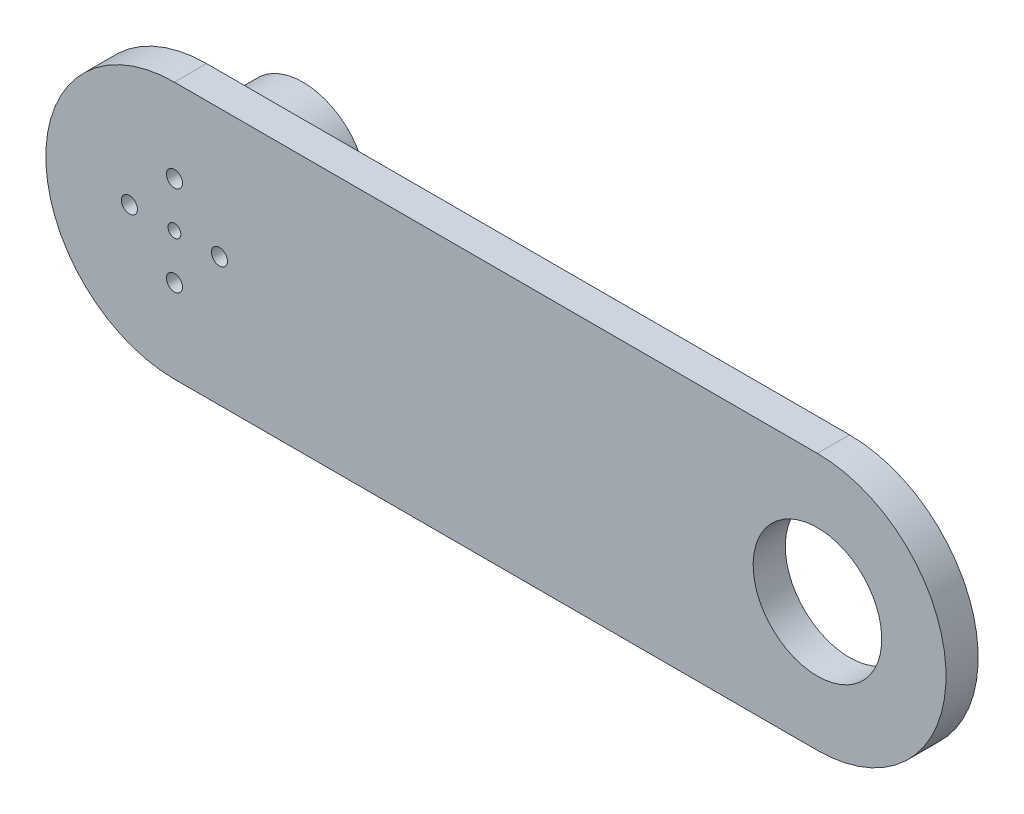
ISO-10303-21;
HEADER;
FILE_DESCRIPTION(('STEP AP214'),'2;1');
FILE_NAME('part.step','',(''),(''),'','','');
FILE_SCHEMA(('AUTOMOTIVE_DESIGN { 1 0 10303 214 1 1 1 1 }'));
ENDSEC;
DATA;
#1=APPLICATION_CONTEXT('core data for automotive mechanical design processes');
#2=APPLICATION_PROTOCOL_DEFINITION('international standard','automotive_design',2000,#1);
#3=PRODUCT_CONTEXT('',#1,'mechanical');
#4=PRODUCT('Part','Part','',(#3));
#5=PRODUCT_RELATED_PRODUCT_CATEGORY('part','',(#4));
#6=PRODUCT_DEFINITION_FORMATION('','',#4);
#7=PRODUCT_DEFINITION_CONTEXT('part definition',#1,'design');
#8=PRODUCT_DEFINITION('design','',#6,#7);
#9=PRODUCT_DEFINITION_SHAPE('','',#8);
#10=(LENGTH_UNIT() NAMED_UNIT(*) SI_UNIT(.MILLI.,.METRE.));
#11=(NAMED_UNIT(*) PLANE_ANGLE_UNIT() SI_UNIT($,.RADIAN.));
#12=(NAMED_UNIT(*) SI_UNIT($,.STERADIAN.) SOLID_ANGLE_UNIT());
#13=UNCERTAINTY_MEASURE_WITH_UNIT(LENGTH_MEASURE(1.E-05),#10,'distance_accuracy_value','');
#14=(GEOMETRIC_REPRESENTATION_CONTEXT(3) GLOBAL_UNCERTAINTY_ASSIGNED_CONTEXT((#13)) GLOBAL_UNIT_ASSIGNED_CONTEXT((#10,
#11,#12)) REPRESENTATION_CONTEXT('',''));
#15=CARTESIAN_POINT('',(0.,0.,0.));
#16=DIRECTION('',(0.,0.,1.));
#17=DIRECTION('',(1.,0.,0.));
#18=AXIS2_PLACEMENT_3D('',#15,#16,#17);
#19=CARTESIAN_POINT('',(0.,0.,0.));
#20=DIRECTION('',(0.,0.,-1.));
#21=DIRECTION('',(0.,1.,0.));
#22=AXIS2_PLACEMENT_3D('',#19,#20,#21);
#23=CYLINDRICAL_SURFACE('',#22,20.);
#24=CARTESIAN_POINT('',(0.,0.,-5.));
#25=DIRECTION('',(0.,0.,1.));
#26=DIRECTION('',(0.,-1.,0.));
#27=AXIS2_PLACEMENT_3D('',#24,#25,#26);
#28=CIRCLE('',#27,20.);
#29=CARTESIAN_POINT('',(0.,20.,-4.99999999999993));
#30=VERTEX_POINT('',#29);
#31=CARTESIAN_POINT('',(0.,-20.,-5.00000000000007));
#32=VERTEX_POINT('',#31);
#33=EDGE_CURVE('E104',#30,#32,#28,.T.);
#34=ORIENTED_EDGE('',*,*,#33,.T.);
#35=DIRECTION('',(0.,0.,-1.));
#36=VECTOR('',#35,1.);
#37=CARTESIAN_POINT('',(0.,-20.,0.));
#38=LINE('',#37,#36);
#39=CARTESIAN_POINT('',(0.,-20.,0.));
#40=VERTEX_POINT('',#39);
#41=EDGE_CURVE('E44',#40,#32,#38,.T.);
#42=ORIENTED_EDGE('',*,*,#41,.F.);
#43=CARTESIAN_POINT('',(0.,0.,0.));
#44=DIRECTION('',(0.,0.,1.));
#45=DIRECTION('',(0.,-1.,0.));
#46=AXIS2_PLACEMENT_3D('',#43,#44,#45);
#47=CIRCLE('',#46,20.);
#48=CARTESIAN_POINT('',(0.,20.,0.));
#49=VERTEX_POINT('',#48);
#50=EDGE_CURVE('E78',#49,#40,#47,.T.);
#51=ORIENTED_EDGE('',*,*,#50,.F.);
#52=DIRECTION('',(0.,0.,-1.));
#53=VECTOR('',#52,1.);
#54=CARTESIAN_POINT('',(0.,20.,0.));
#55=LINE('',#54,#53);
#56=EDGE_CURVE('E52',#49,#30,#55,.T.);
#57=ORIENTED_EDGE('',*,*,#56,.T.);
#58=EDGE_LOOP('',(#34,#42,#51,#57));
#59=FACE_BOUND('',#58,.T.);
#60=ADVANCED_FACE('F36',(#59),#23,.T.);
#61=CARTESIAN_POINT('',(100.,-20.,0.));
#62=DIRECTION('',(0.,-1.,0.));
#63=DIRECTION('',(1.,0.,0.));
#64=AXIS2_PLACEMENT_3D('',#61,#62,#63);
#65=PLANE('',#64);
#66=DIRECTION('',(-1.,0.,0.));
#67=VECTOR('',#66,1.);
#68=CARTESIAN_POINT('',(100.,-20.,-5.00000000000007));
#69=LINE('',#68,#67);
#70=CARTESIAN_POINT('',(100.,-20.,-5.00000000000007));
#71=VERTEX_POINT('',#70);
#72=EDGE_CURVE('E89',#71,#32,#69,.T.);
#73=ORIENTED_EDGE('',*,*,#72,.F.);
#74=DIRECTION('',(0.,0.,-1.));
#75=VECTOR('',#74,1.);
#76=CARTESIAN_POINT('',(100.,-20.,0.));
#77=LINE('',#76,#75);
#78=CARTESIAN_POINT('',(100.,-20.,0.));
#79=VERTEX_POINT('',#78);
#80=EDGE_CURVE('E84',#79,#71,#77,.T.);
#81=ORIENTED_EDGE('',*,*,#80,.F.);
#82=DIRECTION('',(-1.,0.,0.));
#83=VECTOR('',#82,1.);
#84=CARTESIAN_POINT('',(100.,-20.,0.));
#85=LINE('',#84,#83);
#86=EDGE_CURVE('E87',#79,#40,#85,.T.);
#87=ORIENTED_EDGE('',*,*,#86,.T.);
#88=ORIENTED_EDGE('',*,*,#41,.T.);
#89=EDGE_LOOP('',(#73,#81,#87,#88));
#90=FACE_BOUND('',#89,.T.);
#91=ADVANCED_FACE('F86',(#90),#65,.T.);
#92=CARTESIAN_POINT('',(100.,0.,0.));
#93=DIRECTION('',(0.,0.,-1.));
#94=DIRECTION('',(0.,1.,0.));
#95=AXIS2_PLACEMENT_3D('',#92,#93,#94);
#96=CYLINDRICAL_SURFACE('',#95,20.);
#97=CARTESIAN_POINT('',(100.,0.,-5.));
#98=DIRECTION('',(0.,0.,1.));
#99=DIRECTION('',(0.,-1.,0.));
#100=AXIS2_PLACEMENT_3D('',#97,#98,#99);
#101=CIRCLE('',#100,20.);
#102=CARTESIAN_POINT('',(100.,20.,-4.99999999999993));
#103=VERTEX_POINT('',#102);
#104=EDGE_CURVE('E108',#71,#103,#101,.T.);
#105=ORIENTED_EDGE('',*,*,#104,.T.);
#106=DIRECTION('',(0.,0.,-1.));
#107=VECTOR('',#106,1.);
#108=CARTESIAN_POINT('',(100.,20.,0.));
#109=LINE('',#108,#107);
#110=CARTESIAN_POINT('',(100.,20.,0.));
#111=VERTEX_POINT('',#110);
#112=EDGE_CURVE('E67',#111,#103,#109,.T.);
#113=ORIENTED_EDGE('',*,*,#112,.F.);
#114=CARTESIAN_POINT('',(100.,0.,0.));
#115=DIRECTION('',(0.,0.,1.));
#116=DIRECTION('',(0.,-1.,0.));
#117=AXIS2_PLACEMENT_3D('',#114,#115,#116);
#118=CIRCLE('',#117,20.);
#119=EDGE_CURVE('E93',#79,#111,#118,.T.);
#120=ORIENTED_EDGE('',*,*,#119,.F.);
#121=ORIENTED_EDGE('',*,*,#80,.T.);
#122=EDGE_LOOP('',(#105,#113,#120,#121));
#123=FACE_BOUND('',#122,.T.);
#124=ADVANCED_FACE('F94',(#123),#96,.T.);
#125=CARTESIAN_POINT('',(0.,20.,0.));
#126=DIRECTION('',(0.,1.,0.));
#127=DIRECTION('',(-1.,0.,0.));
#128=AXIS2_PLACEMENT_3D('',#125,#126,#127);
#129=PLANE('',#128);
#130=DIRECTION('',(1.,0.,0.));
#131=VECTOR('',#130,1.);
#132=CARTESIAN_POINT('',(0.,20.,-4.99999999999993));
#133=LINE('',#132,#131);
#134=EDGE_CURVE('E99',#30,#103,#133,.T.);
#135=ORIENTED_EDGE('',*,*,#134,.F.);
#136=ORIENTED_EDGE('',*,*,#56,.F.);
#137=DIRECTION('',(1.,0.,0.));
#138=VECTOR('',#137,1.);
#139=CARTESIAN_POINT('',(0.,20.,0.));
#140=LINE('',#139,#138);
#141=EDGE_CURVE('E95',#49,#111,#140,.T.);
#142=ORIENTED_EDGE('',*,*,#141,.T.);
#143=ORIENTED_EDGE('',*,*,#112,.T.);
#144=EDGE_LOOP('',(#135,#136,#142,#143));
#145=FACE_BOUND('',#144,.T.);
#146=ADVANCED_FACE('F115',(#145),#129,.T.);
#147=CARTESIAN_POINT('',(0.,0.,0.));
#148=DIRECTION('',(0.,0.,1.));
#149=DIRECTION('',(0.,-1.,0.));
#150=AXIS2_PLACEMENT_3D('',#147,#148,#149);
#151=PLANE('',#150);
#152=CARTESIAN_POINT('',(100.,0.,0.));
#153=DIRECTION('',(0.,0.,1.));
#154=DIRECTION('',(0.,-1.,0.));
#155=AXIS2_PLACEMENT_3D('',#152,#153,#154);
#156=CIRCLE('',#155,10.);
#157=CARTESIAN_POINT('',(100.,-10.,0.));
#158=VERTEX_POINT('',#157);
#159=EDGE_CURVE('E305',#158,#158,#156,.T.);
#160=ORIENTED_EDGE('',*,*,#159,.F.);
#161=EDGE_LOOP('',(#160));
#162=FACE_BOUND('',#161,.T.);
#163=CARTESIAN_POINT('',(0.,6.99999999999998,0.));
#164=DIRECTION('',(0.,0.,1.));
#165=DIRECTION('',(0.,-1.,0.));
#166=AXIS2_PLACEMENT_3D('',#163,#164,#165);
#167=CIRCLE('',#166,1.25);
#168=CARTESIAN_POINT('',(0.,5.74999999999998,0.));
#169=VERTEX_POINT('',#168);
#170=EDGE_CURVE('E106',#169,#169,#167,.T.);
#171=ORIENTED_EDGE('',*,*,#170,.F.);
#172=EDGE_LOOP('',(#171));
#173=FACE_BOUND('',#172,.T.);
#174=CARTESIAN_POINT('',(-6.999,-0.00100000000001874,0.));
#175=DIRECTION('',(0.,0.,1.));
#176=DIRECTION('',(0.,-1.,0.));
#177=AXIS2_PLACEMENT_3D('',#174,#175,#176);
#178=CIRCLE('',#177,1.25);
#179=CARTESIAN_POINT('',(-6.999,-1.25100000000002,0.));
#180=VERTEX_POINT('',#179);
#181=EDGE_CURVE('E311',#180,#180,#178,.T.);
#182=ORIENTED_EDGE('',*,*,#181,.F.);
#183=EDGE_LOOP('',(#182));
#184=FACE_BOUND('',#183,.T.);
#185=CARTESIAN_POINT('',(0.00200000000000086,-7.00000000000002,0.));
#186=DIRECTION('',(0.,0.,1.));
#187=DIRECTION('',(0.,-1.,0.));
#188=AXIS2_PLACEMENT_3D('',#185,#186,#187);
#189=CIRCLE('',#188,1.25);
#190=CARTESIAN_POINT('',(0.00200000000000086,-8.25000000000002,0.));
#191=VERTEX_POINT('',#190);
#192=EDGE_CURVE('E315',#191,#191,#189,.T.);
#193=ORIENTED_EDGE('',*,*,#192,.F.);
#194=EDGE_LOOP('',(#193));
#195=FACE_BOUND('',#194,.T.);
#196=CARTESIAN_POINT('',(7.001,0.000999999999982971,0.));
#197=DIRECTION('',(0.,0.,1.));
#198=DIRECTION('',(0.,-1.,0.));
#199=AXIS2_PLACEMENT_3D('',#196,#197,#198);
#200=CIRCLE('',#199,1.25);
#201=CARTESIAN_POINT('',(7.001,-1.24900000000002,0.));
#202=VERTEX_POINT('',#201);
#203=EDGE_CURVE('E318',#202,#202,#200,.T.);
#204=ORIENTED_EDGE('',*,*,#203,.F.);
#205=EDGE_LOOP('',(#204));
#206=FACE_BOUND('',#205,.T.);
#207=CARTESIAN_POINT('',(0.,0.,0.));
#208=DIRECTION('',(0.,0.,1.));
#209=DIRECTION('',(0.,-1.,0.));
#210=AXIS2_PLACEMENT_3D('',#207,#208,#209);
#211=CIRCLE('',#210,1.);
#212=CARTESIAN_POINT('',(0.,-1.00000000000002,0.));
#213=VERTEX_POINT('',#212);
#214=EDGE_CURVE('E314',#213,#213,#211,.T.);
#215=ORIENTED_EDGE('',*,*,#214,.F.);
#216=EDGE_LOOP('',(#215));
#217=FACE_BOUND('',#216,.T.);
#218=ORIENTED_EDGE('',*,*,#50,.T.);
#219=ORIENTED_EDGE('',*,*,#86,.F.);
#220=ORIENTED_EDGE('',*,*,#119,.T.);
#221=ORIENTED_EDGE('',*,*,#141,.F.);
#222=EDGE_LOOP('',(#218,#219,#220,#221));
#223=FACE_BOUND('',#222,.T.);
#224=ADVANCED_FACE('F97',(#162,#173,#184,#195,#206,#217,#223),#151,.T.);
#225=CARTESIAN_POINT('',(0.,0.,-5.));
#226=DIRECTION('',(0.,0.,1.));
#227=DIRECTION('',(0.,-1.,0.));
#228=AXIS2_PLACEMENT_3D('',#225,#226,#227);
#229=PLANE('',#228);
#230=CARTESIAN_POINT('',(0.,0.,-5.));
#231=DIRECTION('',(0.,0.,1.));
#232=DIRECTION('',(0.,-1.,0.));
#233=AXIS2_PLACEMENT_3D('',#230,#231,#232);
#234=CIRCLE('',#233,10.);
#235=CARTESIAN_POINT('',(0.,-10.,-5.00000000000003));
#236=VERTEX_POINT('',#235);
#237=EDGE_CURVE('E11',#236,#236,#234,.F.);
#238=ORIENTED_EDGE('',*,*,#237,.F.);
#239=EDGE_LOOP('',(#238));
#240=FACE_BOUND('',#239,.T.);
#241=CARTESIAN_POINT('',(100.,0.,-5.));
#242=DIRECTION('',(0.,0.,1.));
#243=DIRECTION('',(0.,-1.,0.));
#244=AXIS2_PLACEMENT_3D('',#241,#242,#243);
#245=CIRCLE('',#244,10.);
#246=CARTESIAN_POINT('',(100.,-10.,-5.00000000000003));
#247=VERTEX_POINT('',#246);
#248=EDGE_CURVE('E308',#247,#247,#245,.F.);
#249=ORIENTED_EDGE('',*,*,#248,.F.);
#250=EDGE_LOOP('',(#249));
#251=FACE_BOUND('',#250,.T.);
#252=ORIENTED_EDGE('',*,*,#33,.F.);
#253=ORIENTED_EDGE('',*,*,#134,.T.);
#254=ORIENTED_EDGE('',*,*,#104,.F.);
#255=ORIENTED_EDGE('',*,*,#72,.T.);
#256=EDGE_LOOP('',(#252,#253,#254,#255));
#257=FACE_BOUND('',#256,.T.);
#258=ADVANCED_FACE('F114',(#240,#251,#257),#229,.F.);
#259=CARTESIAN_POINT('',(0.,0.,-5.001));
#260=DIRECTION('',(0.,0.,1.));
#261=DIRECTION('',(0.,-1.,0.));
#262=AXIS2_PLACEMENT_3D('',#259,#260,#261);
#263=CYLINDRICAL_SURFACE('',#262,1.);
#264=ORIENTED_EDGE('',*,*,#214,.T.);
#265=EDGE_LOOP('',(#264));
#266=FACE_BOUND('',#265,.T.);
#267=CARTESIAN_POINT('',(0.,0.,-5.));
#268=DIRECTION('',(0.,0.,-1.));
#269=DIRECTION('',(0.,1.,0.));
#270=AXIS2_PLACEMENT_3D('',#267,#268,#269);
#271=CIRCLE('',#270,1.);
#272=CARTESIAN_POINT('',(0.,1.,-5.));
#273=VERTEX_POINT('',#272);
#274=EDGE_CURVE('E302',#273,#273,#271,.F.);
#275=ORIENTED_EDGE('',*,*,#274,.F.);
#276=EDGE_LOOP('',(#275));
#277=FACE_BOUND('',#276,.T.);
#278=ADVANCED_FACE('F156',(#266,#277),#263,.F.);
#279=CARTESIAN_POINT('',(7.001,0.00100000000000043,-5.001));
#280=DIRECTION('',(0.,0.,1.));
#281=DIRECTION('',(0.,-1.,0.));
#282=AXIS2_PLACEMENT_3D('',#279,#280,#281);
#283=CYLINDRICAL_SURFACE('',#282,1.25);
#284=ORIENTED_EDGE('',*,*,#203,.T.);
#285=EDGE_LOOP('',(#284));
#286=FACE_BOUND('',#285,.T.);
#287=CARTESIAN_POINT('',(7.001,0.00100000000000043,-5.));
#288=DIRECTION('',(0.,0.,-1.));
#289=DIRECTION('',(0.,1.,0.));
#290=AXIS2_PLACEMENT_3D('',#287,#288,#289);
#291=CIRCLE('',#290,1.25);
#292=CARTESIAN_POINT('',(7.001,1.251,-5.));
#293=VERTEX_POINT('',#292);
#294=EDGE_CURVE('E299',#293,#293,#291,.F.);
#295=ORIENTED_EDGE('',*,*,#294,.F.);
#296=EDGE_LOOP('',(#295));
#297=FACE_BOUND('',#296,.T.);
#298=ADVANCED_FACE('F165',(#286,#297),#283,.F.);
#299=CARTESIAN_POINT('',(0.00200000000000086,-7.,-5.00100000000002));
#300=DIRECTION('',(0.,0.,1.));
#301=DIRECTION('',(0.,-1.,0.));
#302=AXIS2_PLACEMENT_3D('',#299,#300,#301);
#303=CYLINDRICAL_SURFACE('',#302,1.25);
#304=ORIENTED_EDGE('',*,*,#192,.T.);
#305=EDGE_LOOP('',(#304));
#306=FACE_BOUND('',#305,.T.);
#307=CARTESIAN_POINT('',(0.00200000000000086,-7.,-5.00000000000002));
#308=DIRECTION('',(0.,0.,-1.));
#309=DIRECTION('',(0.,1.,0.));
#310=AXIS2_PLACEMENT_3D('',#307,#308,#309);
#311=CIRCLE('',#310,1.25);
#312=CARTESIAN_POINT('',(0.00200000000000086,-5.75,-5.00000000000002));
#313=VERTEX_POINT('',#312);
#314=EDGE_CURVE('E296',#313,#313,#311,.F.);
#315=ORIENTED_EDGE('',*,*,#314,.F.);
#316=EDGE_LOOP('',(#315));
#317=FACE_BOUND('',#316,.T.);
#318=ADVANCED_FACE('F175',(#306,#317),#303,.F.);
#319=CARTESIAN_POINT('',(-6.999,-0.00100000000000128,-5.001));
#320=DIRECTION('',(0.,0.,1.));
#321=DIRECTION('',(0.,-1.,0.));
#322=AXIS2_PLACEMENT_3D('',#319,#320,#321);
#323=CYLINDRICAL_SURFACE('',#322,1.25);
#324=ORIENTED_EDGE('',*,*,#181,.T.);
#325=EDGE_LOOP('',(#324));
#326=FACE_BOUND('',#325,.T.);
#327=CARTESIAN_POINT('',(-6.999,-0.00100000000000129,-5.));
#328=DIRECTION('',(0.,0.,-1.));
#329=DIRECTION('',(0.,1.,0.));
#330=AXIS2_PLACEMENT_3D('',#327,#328,#329);
#331=CIRCLE('',#330,1.25);
#332=CARTESIAN_POINT('',(-6.999,1.249,-5.));
#333=VERTEX_POINT('',#332);
#334=EDGE_CURVE('E291',#333,#333,#331,.F.);
#335=ORIENTED_EDGE('',*,*,#334,.F.);
#336=EDGE_LOOP('',(#335));
#337=FACE_BOUND('',#336,.T.);
#338=ADVANCED_FACE('F185',(#326,#337),#323,.F.);
#339=CARTESIAN_POINT('',(0.,7.,-5.00099999999998));
#340=DIRECTION('',(0.,0.,1.));
#341=DIRECTION('',(0.,-1.,0.));
#342=AXIS2_PLACEMENT_3D('',#339,#340,#341);
#343=CYLINDRICAL_SURFACE('',#342,1.25);
#344=ORIENTED_EDGE('',*,*,#170,.T.);
#345=EDGE_LOOP('',(#344));
#346=FACE_BOUND('',#345,.T.);
#347=CARTESIAN_POINT('',(0.,7.,-4.99999999999998));
#348=DIRECTION('',(0.,0.,-1.));
#349=DIRECTION('',(0.,1.,0.));
#350=AXIS2_PLACEMENT_3D('',#347,#348,#349);
#351=CIRCLE('',#350,1.25);
#352=CARTESIAN_POINT('',(0.,8.25,-4.99999999999997));
#353=VERTEX_POINT('',#352);
#354=EDGE_CURVE('E288',#353,#353,#351,.F.);
#355=ORIENTED_EDGE('',*,*,#354,.F.);
#356=EDGE_LOOP('',(#355));
#357=FACE_BOUND('',#356,.T.);
#358=ADVANCED_FACE('F195',(#346,#357),#343,.F.);
#359=CARTESIAN_POINT('',(100.,0.,-5.001));
#360=DIRECTION('',(0.,0.,1.));
#361=DIRECTION('',(0.,-1.,0.));
#362=AXIS2_PLACEMENT_3D('',#359,#360,#361);
#363=CYLINDRICAL_SURFACE('',#362,10.);
#364=ORIENTED_EDGE('',*,*,#159,.T.);
#365=EDGE_LOOP('',(#364));
#366=FACE_BOUND('',#365,.T.);
#367=ORIENTED_EDGE('',*,*,#248,.T.);
#368=EDGE_LOOP('',(#367));
#369=FACE_BOUND('',#368,.T.);
#370=ADVANCED_FACE('F205',(#366,#369),#363,.F.);
#371=CARTESIAN_POINT('',(0.,0.,-5.));
#372=DIRECTION('',(0.,0.,-1.));
#373=DIRECTION('',(0.,1.,0.));
#374=AXIS2_PLACEMENT_3D('',#371,#372,#373);
#375=PLANE('',#374);
#376=ORIENTED_EDGE('',*,*,#354,.T.);
#377=EDGE_LOOP('',(#376));
#378=FACE_BOUND('',#377,.T.);
#379=ADVANCED_FACE('F215',(#378),#375,.F.);
#380=ORIENTED_EDGE('',*,*,#334,.T.);
#381=EDGE_LOOP('',(#380));
#382=FACE_BOUND('',#381,.T.);
#383=ADVANCED_FACE('F225',(#382),#375,.F.);
#384=ORIENTED_EDGE('',*,*,#314,.T.);
#385=EDGE_LOOP('',(#384));
#386=FACE_BOUND('',#385,.T.);
#387=ADVANCED_FACE('F236',(#386),#375,.F.);
#388=ORIENTED_EDGE('',*,*,#294,.T.);
#389=EDGE_LOOP('',(#388));
#390=FACE_BOUND('',#389,.T.);
#391=ADVANCED_FACE('F245',(#390),#375,.F.);
#392=ORIENTED_EDGE('',*,*,#274,.T.);
#393=EDGE_LOOP('',(#392));
#394=FACE_BOUND('',#393,.T.);
#395=ADVANCED_FACE('F228',(#394),#375,.F.);
#396=CARTESIAN_POINT('',(0.,0.,-20.));
#397=DIRECTION('',(0.,0.,1.));
#398=DIRECTION('',(0.,-1.,0.));
#399=AXIS2_PLACEMENT_3D('',#396,#397,#398);
#400=CYLINDRICAL_SURFACE('',#399,10.);
#401=CARTESIAN_POINT('',(0.,0.,-20.));
#402=DIRECTION('',(0.,0.,-1.));
#403=DIRECTION('',(0.,1.,0.));
#404=AXIS2_PLACEMENT_3D('',#401,#402,#403);
#405=CIRCLE('',#404,10.);
#406=CARTESIAN_POINT('',(0.,10.0000000000001,-20.));
#407=VERTEX_POINT('',#406);
#408=EDGE_CURVE('E287',#407,#407,#405,.T.);
#409=ORIENTED_EDGE('',*,*,#408,.F.);
#410=EDGE_LOOP('',(#409));
#411=FACE_BOUND('',#410,.T.);
#412=ORIENTED_EDGE('',*,*,#237,.T.);
#413=EDGE_LOOP('',(#412));
#414=FACE_BOUND('',#413,.T.);
#415=ADVANCED_FACE('F262',(#411,#414),#400,.T.);
#416=CARTESIAN_POINT('',(0.,0.,-20.));
#417=DIRECTION('',(0.,0.,-1.));
#418=DIRECTION('',(0.,1.,0.));
#419=AXIS2_PLACEMENT_3D('',#416,#417,#418);
#420=PLANE('',#419);
#421=ORIENTED_EDGE('',*,*,#408,.T.);
#422=EDGE_LOOP('',(#421));
#423=FACE_BOUND('',#422,.T.);
#424=ADVANCED_FACE('F271',(#423),#420,.T.);
#425=CLOSED_SHELL('',(#60,#91,#124,#146,#224,#258,#278,#298,#318,#338,#358,#370,#379,#383,#387,
#391,#395,#415,#424));
#426=MANIFOLD_SOLID_BREP('B2',#425);
#427=ADVANCED_BREP_SHAPE_REPRESENTATION('',(#18,#426),#14);
#428=SHAPE_DEFINITION_REPRESENTATION(#9,#427);
ENDSEC;
END-ISO-10303-21;
